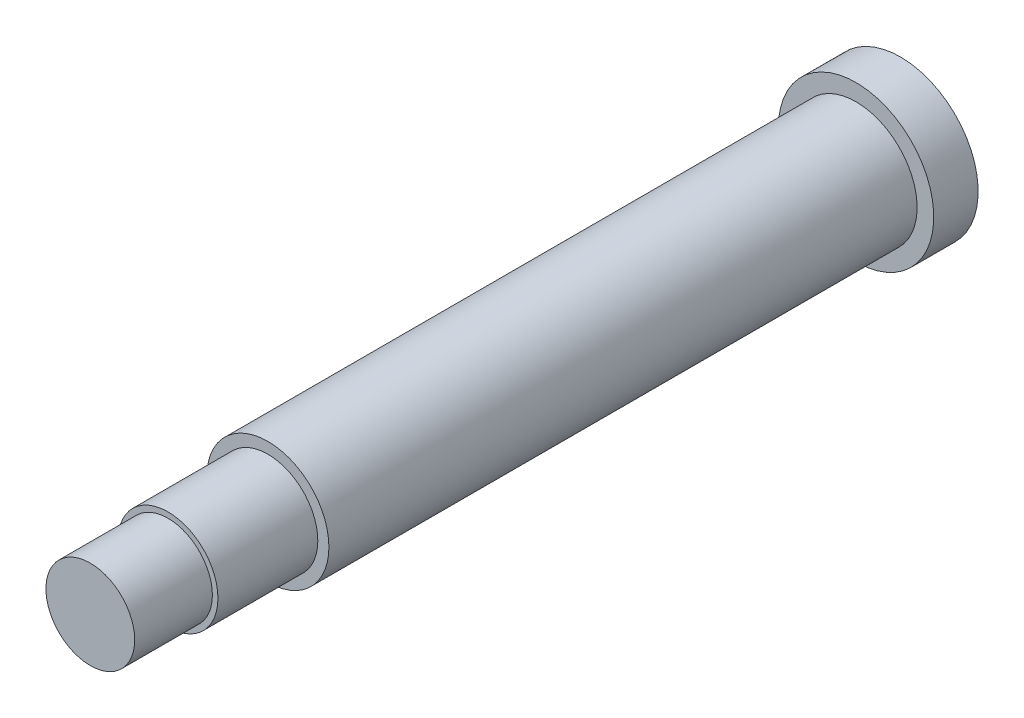
ISO-10303-21;
HEADER;
FILE_DESCRIPTION(('STEP AP214'),'2;1');
FILE_NAME('part.step','',(''),(''),'','','');
FILE_SCHEMA(('AUTOMOTIVE_DESIGN { 1 0 10303 214 1 1 1 1 }'));
ENDSEC;
DATA;
#1=APPLICATION_CONTEXT('core data for automotive mechanical design processes');
#2=APPLICATION_PROTOCOL_DEFINITION('international standard','automotive_design',2000,#1);
#3=PRODUCT_CONTEXT('',#1,'mechanical');
#4=PRODUCT('Part','Part','',(#3));
#5=PRODUCT_RELATED_PRODUCT_CATEGORY('part','',(#4));
#6=PRODUCT_DEFINITION_FORMATION('','',#4);
#7=PRODUCT_DEFINITION_CONTEXT('part definition',#1,'design');
#8=PRODUCT_DEFINITION('design','',#6,#7);
#9=PRODUCT_DEFINITION_SHAPE('','',#8);
#10=(LENGTH_UNIT() NAMED_UNIT(*) SI_UNIT(.MILLI.,.METRE.));
#11=(NAMED_UNIT(*) PLANE_ANGLE_UNIT() SI_UNIT($,.RADIAN.));
#12=(NAMED_UNIT(*) SI_UNIT($,.STERADIAN.) SOLID_ANGLE_UNIT());
#13=UNCERTAINTY_MEASURE_WITH_UNIT(LENGTH_MEASURE(1.E-05),#10,'distance_accuracy_value','');
#14=(GEOMETRIC_REPRESENTATION_CONTEXT(3) GLOBAL_UNCERTAINTY_ASSIGNED_CONTEXT((#13)) GLOBAL_UNIT_ASSIGNED_CONTEXT((#10,
#11,#12)) REPRESENTATION_CONTEXT('',''));
#15=CARTESIAN_POINT('',(0.,0.,0.));
#16=DIRECTION('',(0.,0.,1.));
#17=DIRECTION('',(1.,0.,0.));
#18=AXIS2_PLACEMENT_3D('',#15,#16,#17);
#19=CARTESIAN_POINT('',(0.,0.,66.));
#20=DIRECTION('',(0.,0.,1.));
#21=DIRECTION('',(1.,0.,0.));
#22=AXIS2_PLACEMENT_3D('',#19,#20,#21);
#23=PLANE('',#22);
#24=CARTESIAN_POINT('',(0.,0.,66.));
#25=DIRECTION('',(0.,0.,1.));
#26=DIRECTION('',(1.,0.,0.));
#27=AXIS2_PLACEMENT_3D('',#24,#25,#26);
#28=CIRCLE('',#27,4.5);
#29=CARTESIAN_POINT('',(4.5,0.,66.));
#30=VERTEX_POINT('',#29);
#31=EDGE_CURVE('E59',#30,#30,#28,.T.);
#32=ORIENTED_EDGE('',*,*,#31,.T.);
#33=EDGE_LOOP('',(#32));
#34=FACE_BOUND('',#33,.T.);
#35=CARTESIAN_POINT('',(0.,0.,66.));
#36=DIRECTION('',(0.,0.,1.));
#37=DIRECTION('',(1.,0.,0.));
#38=AXIS2_PLACEMENT_3D('',#35,#36,#37);
#39=CIRCLE('',#38,4.);
#40=CARTESIAN_POINT('',(4.,0.,66.));
#41=VERTEX_POINT('',#40);
#42=EDGE_CURVE('E68',#41,#41,#39,.T.);
#43=ORIENTED_EDGE('',*,*,#42,.F.);
#44=EDGE_LOOP('',(#43));
#45=FACE_BOUND('',#44,.T.);
#46=ADVANCED_FACE('F43',(#34,#45),#23,.T.);
#47=CARTESIAN_POINT('',(0.,0.,66.));
#48=DIRECTION('',(0.,0.,-1.));
#49=DIRECTION('',(-1.,0.,0.));
#50=AXIS2_PLACEMENT_3D('',#47,#48,#49);
#51=CYLINDRICAL_SURFACE('',#50,5.5);
#52=CARTESIAN_POINT('',(0.,0.,57.));
#53=DIRECTION('',(0.,0.,1.));
#54=DIRECTION('',(1.,0.,0.));
#55=AXIS2_PLACEMENT_3D('',#52,#53,#54);
#56=CIRCLE('',#55,5.5);
#57=CARTESIAN_POINT('',(5.5,0.,57.));
#58=VERTEX_POINT('',#57);
#59=EDGE_CURVE('E49',#58,#58,#56,.T.);
#60=ORIENTED_EDGE('',*,*,#59,.F.);
#61=EDGE_LOOP('',(#60));
#62=FACE_BOUND('',#61,.T.);
#63=CARTESIAN_POINT('',(0.,0.,4.));
#64=DIRECTION('',(0.,0.,-1.));
#65=DIRECTION('',(-1.,0.,0.));
#66=AXIS2_PLACEMENT_3D('',#63,#64,#65);
#67=CIRCLE('',#66,5.5);
#68=CARTESIAN_POINT('',(-5.5,0.,4.));
#69=VERTEX_POINT('',#68);
#70=EDGE_CURVE('E10',#69,#69,#67,.T.);
#71=ORIENTED_EDGE('',*,*,#70,.F.);
#72=EDGE_LOOP('',(#71));
#73=FACE_BOUND('',#72,.T.);
#74=ADVANCED_FACE('F44',(#62,#73),#51,.T.);
#75=CARTESIAN_POINT('',(0.,0.,57.));
#76=DIRECTION('',(0.,0.,1.));
#77=DIRECTION('',(1.,0.,0.));
#78=AXIS2_PLACEMENT_3D('',#75,#76,#77);
#79=PLANE('',#78);
#80=CARTESIAN_POINT('',(0.,0.,57.));
#81=DIRECTION('',(0.,0.,1.));
#82=DIRECTION('',(1.,0.,0.));
#83=AXIS2_PLACEMENT_3D('',#80,#81,#82);
#84=CIRCLE('',#83,4.5);
#85=CARTESIAN_POINT('',(4.5,0.,57.));
#86=VERTEX_POINT('',#85);
#87=EDGE_CURVE('E53',#86,#86,#84,.T.);
#88=ORIENTED_EDGE('',*,*,#87,.F.);
#89=EDGE_LOOP('',(#88));
#90=FACE_BOUND('',#89,.T.);
#91=ORIENTED_EDGE('',*,*,#59,.T.);
#92=EDGE_LOOP('',(#91));
#93=FACE_BOUND('',#92,.T.);
#94=ADVANCED_FACE('F93',(#90,#93),#79,.T.);
#95=CARTESIAN_POINT('',(0.,0.,57.));
#96=DIRECTION('',(0.,0.,1.));
#97=DIRECTION('',(1.,0.,0.));
#98=AXIS2_PLACEMENT_3D('',#95,#96,#97);
#99=CYLINDRICAL_SURFACE('',#98,4.5);
#100=ORIENTED_EDGE('',*,*,#87,.T.);
#101=EDGE_LOOP('',(#100));
#102=FACE_BOUND('',#101,.T.);
#103=ORIENTED_EDGE('',*,*,#31,.F.);
#104=EDGE_LOOP('',(#103));
#105=FACE_BOUND('',#104,.T.);
#106=ADVANCED_FACE('F108',(#102,#105),#99,.T.);
#107=CARTESIAN_POINT('',(0.,0.,4.));
#108=DIRECTION('',(0.,0.,-1.));
#109=DIRECTION('',(-1.,0.,0.));
#110=AXIS2_PLACEMENT_3D('',#107,#108,#109);
#111=PLANE('',#110);
#112=CARTESIAN_POINT('',(0.,0.,4.));
#113=DIRECTION('',(0.,0.,-1.));
#114=DIRECTION('',(-1.,0.,0.));
#115=AXIS2_PLACEMENT_3D('',#112,#113,#114);
#116=CIRCLE('',#115,7.);
#117=CARTESIAN_POINT('',(-7.,0.,4.));
#118=VERTEX_POINT('',#117);
#119=EDGE_CURVE('E64',#118,#118,#116,.T.);
#120=ORIENTED_EDGE('',*,*,#119,.F.);
#121=EDGE_LOOP('',(#120));
#122=FACE_BOUND('',#121,.T.);
#123=ORIENTED_EDGE('',*,*,#70,.T.);
#124=EDGE_LOOP('',(#123));
#125=FACE_BOUND('',#124,.T.);
#126=ADVANCED_FACE('F101',(#122,#125),#111,.F.);
#127=CARTESIAN_POINT('',(0.,0.,4.));
#128=DIRECTION('',(0.,0.,-1.));
#129=DIRECTION('',(-1.,0.,0.));
#130=AXIS2_PLACEMENT_3D('',#127,#128,#129);
#131=CYLINDRICAL_SURFACE('',#130,7.);
#132=ORIENTED_EDGE('',*,*,#119,.T.);
#133=EDGE_LOOP('',(#132));
#134=FACE_BOUND('',#133,.T.);
#135=CARTESIAN_POINT('',(0.,0.,0.));
#136=DIRECTION('',(0.,0.,-1.));
#137=DIRECTION('',(-1.,0.,0.));
#138=AXIS2_PLACEMENT_3D('',#135,#136,#137);
#139=CIRCLE('',#138,7.);
#140=CARTESIAN_POINT('',(-7.,0.,0.));
#141=VERTEX_POINT('',#140);
#142=EDGE_CURVE('E65',#141,#141,#139,.T.);
#143=ORIENTED_EDGE('',*,*,#142,.F.);
#144=EDGE_LOOP('',(#143));
#145=FACE_BOUND('',#144,.T.);
#146=ADVANCED_FACE('F96',(#134,#145),#131,.T.);
#147=CARTESIAN_POINT('',(0.,0.,0.));
#148=DIRECTION('',(0.,0.,1.));
#149=DIRECTION('',(1.,0.,0.));
#150=AXIS2_PLACEMENT_3D('',#147,#148,#149);
#151=PLANE('',#150);
#152=ORIENTED_EDGE('',*,*,#142,.T.);
#153=EDGE_LOOP('',(#152));
#154=FACE_BOUND('',#153,.T.);
#155=ADVANCED_FACE('F82',(#154),#151,.F.);
#156=CARTESIAN_POINT('',(0.,0.,73.));
#157=DIRECTION('',(0.,0.,-1.));
#158=DIRECTION('',(-1.,0.,0.));
#159=AXIS2_PLACEMENT_3D('',#156,#157,#158);
#160=CYLINDRICAL_SURFACE('',#159,4.);
#161=CARTESIAN_POINT('',(0.,0.,73.));
#162=DIRECTION('',(0.,0.,1.));
#163=DIRECTION('',(1.,0.,0.));
#164=AXIS2_PLACEMENT_3D('',#161,#162,#163);
#165=CIRCLE('',#164,4.);
#166=CARTESIAN_POINT('',(4.,0.,73.));
#167=VERTEX_POINT('',#166);
#168=EDGE_CURVE('E70',#167,#167,#165,.T.);
#169=ORIENTED_EDGE('',*,*,#168,.F.);
#170=EDGE_LOOP('',(#169));
#171=FACE_BOUND('',#170,.T.);
#172=ORIENTED_EDGE('',*,*,#42,.T.);
#173=EDGE_LOOP('',(#172));
#174=FACE_BOUND('',#173,.T.);
#175=ADVANCED_FACE('F77',(#171,#174),#160,.T.);
#176=CARTESIAN_POINT('',(0.,0.,73.));
#177=DIRECTION('',(0.,0.,1.));
#178=DIRECTION('',(1.,0.,0.));
#179=AXIS2_PLACEMENT_3D('',#176,#177,#178);
#180=PLANE('',#179);
#181=ORIENTED_EDGE('',*,*,#168,.T.);
#182=EDGE_LOOP('',(#181));
#183=FACE_BOUND('',#182,.T.);
#184=ADVANCED_FACE('F78',(#183),#180,.T.);
#185=CLOSED_SHELL('',(#46,#74,#94,#106,#126,#146,#155,#175,#184));
#186=MANIFOLD_SOLID_BREP('B2',#185);
#187=ADVANCED_BREP_SHAPE_REPRESENTATION('',(#18,#186),#14);
#188=SHAPE_DEFINITION_REPRESENTATION(#9,#187);
ENDSEC;
END-ISO-10303-21;
